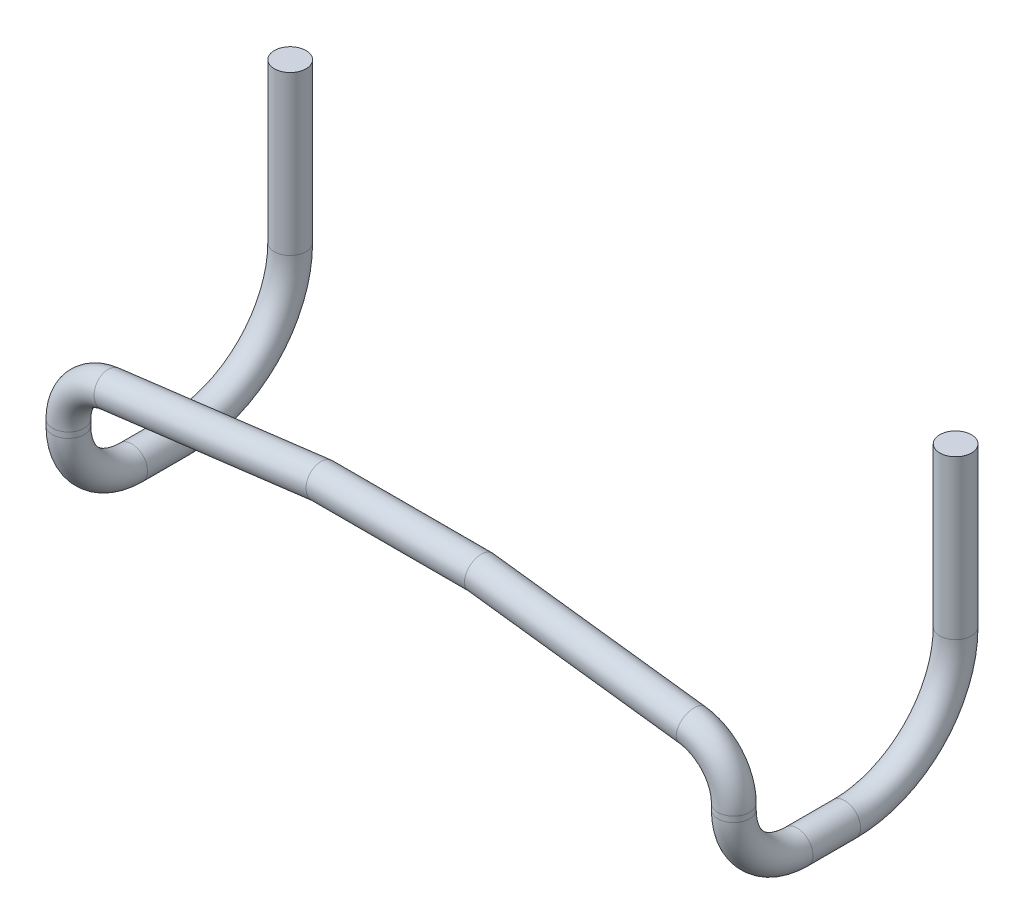
ISO-10303-21;
HEADER;
FILE_DESCRIPTION(('STEP AP214'),'2;1');
FILE_NAME('part.step','',(''),(''),'','','');
FILE_SCHEMA(('AUTOMOTIVE_DESIGN { 1 0 10303 214 1 1 1 1 }'));
ENDSEC;
DATA;
#1=APPLICATION_CONTEXT('core data for automotive mechanical design processes');
#2=APPLICATION_PROTOCOL_DEFINITION('international standard','automotive_design',2000,#1);
#3=PRODUCT_CONTEXT('',#1,'mechanical');
#4=PRODUCT('Part','Part','',(#3));
#5=PRODUCT_RELATED_PRODUCT_CATEGORY('part','',(#4));
#6=PRODUCT_DEFINITION_FORMATION('','',#4);
#7=PRODUCT_DEFINITION_CONTEXT('part definition',#1,'design');
#8=PRODUCT_DEFINITION('design','',#6,#7);
#9=PRODUCT_DEFINITION_SHAPE('','',#8);
#10=(LENGTH_UNIT() NAMED_UNIT(*) SI_UNIT(.MILLI.,.METRE.));
#11=(NAMED_UNIT(*) PLANE_ANGLE_UNIT() SI_UNIT($,.RADIAN.));
#12=(NAMED_UNIT(*) SI_UNIT($,.STERADIAN.) SOLID_ANGLE_UNIT());
#13=UNCERTAINTY_MEASURE_WITH_UNIT(LENGTH_MEASURE(1.E-05),#10,'distance_accuracy_value','');
#14=(GEOMETRIC_REPRESENTATION_CONTEXT(3) GLOBAL_UNCERTAINTY_ASSIGNED_CONTEXT((#13)) GLOBAL_UNIT_ASSIGNED_CONTEXT((#10,
#11,#12)) REPRESENTATION_CONTEXT('',''));
#15=CARTESIAN_POINT('',(0.,0.,0.));
#16=DIRECTION('',(0.,0.,1.));
#17=DIRECTION('',(1.,0.,0.));
#18=AXIS2_PLACEMENT_3D('',#15,#16,#17);
#19=CARTESIAN_POINT('',(210.,80.,-140.));
#20=DIRECTION('',(0.,-1.,0.));
#21=DIRECTION('',(0.,0.,-1.));
#22=AXIS2_PLACEMENT_3D('',#19,#20,#21);
#23=PLANE('',#22);
#24=CARTESIAN_POINT('',(210.,80.,-140.));
#25=DIRECTION('',(0.,-1.,0.));
#26=DIRECTION('',(0.,0.,-1.));
#27=AXIS2_PLACEMENT_3D('',#24,#25,#26);
#28=CIRCLE('',#27,10.);
#29=CARTESIAN_POINT('',(210.,80.,-150.));
#30=VERTEX_POINT('',#29);
#31=EDGE_CURVE('E79',#30,#30,#28,.T.);
#32=ORIENTED_EDGE('',*,*,#31,.F.);
#33=EDGE_LOOP('',(#32));
#34=FACE_BOUND('',#33,.T.);
#35=ADVANCED_FACE('F61',(#34),#23,.F.);
#36=CARTESIAN_POINT('',(48.5416785139341,0.182290185758244,0.));
#37=DIRECTION('',(0.992277876713668,-0.124034734589209,0.));
#38=DIRECTION('',(0.124034734589209,0.992277876713668,0.));
#39=AXIS2_PLACEMENT_3D('',#36,#37,#38);
#40=CYLINDRICAL_SURFACE('',#39,10.);
#41=CARTESIAN_POINT('',(50.,0.,0.));
#42=DIRECTION('',(0.99806760209759,-0.0621374415563289,0.));
#43=DIRECTION('',(0.0621374415563289,0.99806760209759,0.));
#44=AXIS2_PLACEMENT_3D('',#41,#42,#43);
#45=ELLIPSE('',#44,10.0193613929392,10.);
#46=CARTESIAN_POINT('',(50.6225774829855,10.,0.));
#47=VERTEX_POINT('',#46);
#48=EDGE_CURVE('E11',#47,#47,#45,.T.);
#49=ORIENTED_EDGE('',*,*,#48,.T.);
#50=EDGE_LOOP('',(#49));
#51=FACE_BOUND('',#50,.T.);
#52=CARTESIAN_POINT('',(183.721042037676,-16.7151302547096,0.));
#53=DIRECTION('',(-0.992277876713668,0.124034734589209,0.));
#54=DIRECTION('',(0.,0.,1.));
#55=AXIS2_PLACEMENT_3D('',#52,#53,#54);
#56=CIRCLE('',#55,10.);
#57=CARTESIAN_POINT('',(184.961389383568,-6.79235148757287,0.));
#58=VERTEX_POINT('',#57);
#59=EDGE_CURVE('E64',#58,#58,#56,.T.);
#60=ORIENTED_EDGE('',*,*,#59,.T.);
#61=EDGE_LOOP('',(#60));
#62=FACE_BOUND('',#61,.T.);
#63=ADVANCED_FACE('F118',(#51,#62),#40,.T.);
#64=CARTESIAN_POINT('',(180.,-46.4834665561196,0.));
#65=DIRECTION('',(0.,0.,-1.));
#66=DIRECTION('',(-1.,0.,0.));
#67=AXIS2_PLACEMENT_3D('',#64,#65,#66);
#68=TOROIDAL_SURFACE('',#67,30.,10.);
#69=CARTESIAN_POINT('',(210.,-46.4834665561196,0.));
#70=DIRECTION('',(0.,1.,0.));
#71=DIRECTION('',(0.,0.,1.));
#72=AXIS2_PLACEMENT_3D('',#69,#70,#71);
#73=CIRCLE('',#72,10.);
#74=CARTESIAN_POINT('',(220.,-46.4834665561196,0.));
#75=VERTEX_POINT('',#74);
#76=EDGE_CURVE('E74',#75,#75,#73,.T.);
#77=CARTESIAN_POINT('',(180.,-46.4834665561196,0.));
#78=DIRECTION('',(0.,0.,-1.));
#79=DIRECTION('',(-1.,0.,0.));
#80=AXIS2_PLACEMENT_3D('',#77,#78,#79);
#81=CIRCLE('',#80,40.);
#82=EDGE_CURVE('',#58,#75,#81,.T.);
#83=ORIENTED_EDGE('',*,*,#59,.F.);
#84=ORIENTED_EDGE('',*,*,#76,.T.);
#85=ORIENTED_EDGE('',*,*,#82,.T.);
#86=ORIENTED_EDGE('',*,*,#82,.F.);
#87=EDGE_LOOP('',(#83,#85,#84,#86));
#88=FACE_BOUND('',#87,.T.);
#89=ADVANCED_FACE('F103',(#88),#68,.T.);
#90=CARTESIAN_POINT('',(210.,-46.4834665561196,0.));
#91=DIRECTION('',(0.,-1.,0.));
#92=DIRECTION('',(0.,0.,-1.));
#93=AXIS2_PLACEMENT_3D('',#90,#91,#92);
#94=CYLINDRICAL_SURFACE('',#93,10.);
#95=CARTESIAN_POINT('',(210.,-50.,0.));
#96=DIRECTION('',(0.,1.,0.));
#97=DIRECTION('',(0.,0.,1.));
#98=AXIS2_PLACEMENT_3D('',#95,#96,#97);
#99=CIRCLE('',#98,10.);
#100=CARTESIAN_POINT('',(210.,-50.,10.));
#101=VERTEX_POINT('',#100);
#102=EDGE_CURVE('E96',#101,#101,#99,.T.);
#103=ORIENTED_EDGE('',*,*,#102,.T.);
#104=EDGE_LOOP('',(#103));
#105=FACE_BOUND('',#104,.T.);
#106=ORIENTED_EDGE('',*,*,#76,.F.);
#107=EDGE_LOOP('',(#106));
#108=FACE_BOUND('',#107,.T.);
#109=ADVANCED_FACE('F106',(#105,#108),#94,.T.);
#110=CARTESIAN_POINT('',(210.,-50.,-40.));
#111=DIRECTION('',(1.,0.,0.));
#112=DIRECTION('',(0.,0.,-1.));
#113=AXIS2_PLACEMENT_3D('',#110,#111,#112);
#114=TOROIDAL_SURFACE('',#113,40.,10.);
#115=CARTESIAN_POINT('',(210.,-90.,-40.));
#116=DIRECTION('',(0.,0.,1.));
#117=DIRECTION('',(0.,-1.,0.));
#118=AXIS2_PLACEMENT_3D('',#115,#116,#117);
#119=CIRCLE('',#118,10.);
#120=CARTESIAN_POINT('',(210.,-100.,-40.));
#121=VERTEX_POINT('',#120);
#122=EDGE_CURVE('E92',#121,#121,#119,.T.);
#123=CARTESIAN_POINT('',(210.,-50.,-40.));
#124=DIRECTION('',(1.,0.,0.));
#125=DIRECTION('',(0.,0.,-1.));
#126=AXIS2_PLACEMENT_3D('',#123,#124,#125);
#127=CIRCLE('',#126,50.);
#128=EDGE_CURVE('',#101,#121,#127,.T.);
#129=ORIENTED_EDGE('',*,*,#102,.F.);
#130=ORIENTED_EDGE('',*,*,#122,.T.);
#131=ORIENTED_EDGE('',*,*,#128,.T.);
#132=ORIENTED_EDGE('',*,*,#128,.F.);
#133=EDGE_LOOP('',(#129,#131,#130,#132));
#134=FACE_BOUND('',#133,.T.);
#135=ADVANCED_FACE('F108',(#134),#114,.T.);
#136=CARTESIAN_POINT('',(210.,-90.,-40.));
#137=DIRECTION('',(0.,0.,-1.));
#138=DIRECTION('',(-1.,0.,0.));
#139=AXIS2_PLACEMENT_3D('',#136,#137,#138);
#140=CYLINDRICAL_SURFACE('',#139,10.);
#141=CARTESIAN_POINT('',(210.,-90.,-70.));
#142=DIRECTION('',(0.,0.,1.));
#143=DIRECTION('',(0.,-1.,0.));
#144=AXIS2_PLACEMENT_3D('',#141,#142,#143);
#145=CIRCLE('',#144,10.);
#146=CARTESIAN_POINT('',(210.,-100.,-70.));
#147=VERTEX_POINT('',#146);
#148=EDGE_CURVE('E88',#147,#147,#145,.T.);
#149=ORIENTED_EDGE('',*,*,#148,.T.);
#150=EDGE_LOOP('',(#149));
#151=FACE_BOUND('',#150,.T.);
#152=ORIENTED_EDGE('',*,*,#122,.F.);
#153=EDGE_LOOP('',(#152));
#154=FACE_BOUND('',#153,.T.);
#155=ADVANCED_FACE('F115',(#151,#154),#140,.T.);
#156=CARTESIAN_POINT('',(210.,-20.,-70.));
#157=DIRECTION('',(1.,0.,0.));
#158=DIRECTION('',(0.,0.,-1.));
#159=AXIS2_PLACEMENT_3D('',#156,#157,#158);
#160=TOROIDAL_SURFACE('',#159,70.,10.);
#161=CARTESIAN_POINT('',(210.,-20.,-140.));
#162=DIRECTION('',(0.,-1.,0.));
#163=DIRECTION('',(0.,0.,-1.));
#164=AXIS2_PLACEMENT_3D('',#161,#162,#163);
#165=CIRCLE('',#164,10.);
#166=CARTESIAN_POINT('',(210.,-20.,-150.));
#167=VERTEX_POINT('',#166);
#168=EDGE_CURVE('E83',#167,#167,#165,.T.);
#169=CARTESIAN_POINT('',(210.,-20.,-70.));
#170=DIRECTION('',(1.,0.,0.));
#171=DIRECTION('',(0.,0.,-1.));
#172=AXIS2_PLACEMENT_3D('',#169,#170,#171);
#173=CIRCLE('',#172,80.);
#174=EDGE_CURVE('',#147,#167,#173,.T.);
#175=ORIENTED_EDGE('',*,*,#148,.F.);
#176=ORIENTED_EDGE('',*,*,#168,.T.);
#177=ORIENTED_EDGE('',*,*,#174,.T.);
#178=ORIENTED_EDGE('',*,*,#174,.F.);
#179=EDGE_LOOP('',(#175,#177,#176,#178));
#180=FACE_BOUND('',#179,.T.);
#181=ADVANCED_FACE('F133',(#180),#160,.T.);
#182=CARTESIAN_POINT('',(210.,-20.,-140.));
#183=DIRECTION('',(0.,1.,0.));
#184=DIRECTION('',(0.,0.,1.));
#185=AXIS2_PLACEMENT_3D('',#182,#183,#184);
#186=CYLINDRICAL_SURFACE('',#185,10.);
#187=ORIENTED_EDGE('',*,*,#31,.T.);
#188=EDGE_LOOP('',(#187));
#189=FACE_BOUND('',#188,.T.);
#190=ORIENTED_EDGE('',*,*,#168,.F.);
#191=EDGE_LOOP('',(#190));
#192=FACE_BOUND('',#191,.T.);
#193=ADVANCED_FACE('F123',(#189,#192),#186,.T.);
#194=CARTESIAN_POINT('',(0.,0.,0.));
#195=DIRECTION('',(1.,0.,0.));
#196=DIRECTION('',(0.,0.,-1.));
#197=AXIS2_PLACEMENT_3D('',#194,#195,#196);
#198=CYLINDRICAL_SURFACE('',#197,10.);
#199=ORIENTED_EDGE('',*,*,#48,.F.);
#200=EDGE_LOOP('',(#199));
#201=FACE_BOUND('',#200,.T.);
#202=CARTESIAN_POINT('',(-50.,0.,0.));
#203=DIRECTION('',(-0.99806760209759,-0.0621374415563289,0.));
#204=DIRECTION('',(-0.0621374415563289,0.99806760209759,0.));
#205=AXIS2_PLACEMENT_3D('',#202,#203,#204);
#206=ELLIPSE('',#205,10.0193613929392,10.);
#207=CARTESIAN_POINT('',(-50.6225774829855,10.,0.));
#208=VERTEX_POINT('',#207);
#209=EDGE_CURVE('E84',#208,#208,#206,.T.);
#210=ORIENTED_EDGE('',*,*,#209,.F.);
#211=EDGE_LOOP('',(#210));
#212=FACE_BOUND('',#211,.T.);
#213=ADVANCED_FACE('F120',(#201,#212),#198,.T.);
#214=CARTESIAN_POINT('',(-210.,80.,-140.));
#215=DIRECTION('',(0.,-1.,0.));
#216=DIRECTION('',(0.,0.,-1.));
#217=AXIS2_PLACEMENT_3D('',#214,#215,#216);
#218=PLANE('',#217);
#219=CARTESIAN_POINT('',(-210.,80.,-140.));
#220=DIRECTION('',(0.,1.,0.));
#221=DIRECTION('',(0.,0.,-1.));
#222=AXIS2_PLACEMENT_3D('',#219,#220,#221);
#223=CIRCLE('',#222,10.);
#224=CARTESIAN_POINT('',(-210.,80.,-150.));
#225=VERTEX_POINT('',#224);
#226=EDGE_CURVE('E286',#225,#225,#223,.F.);
#227=ORIENTED_EDGE('',*,*,#226,.F.);
#228=EDGE_LOOP('',(#227));
#229=FACE_BOUND('',#228,.T.);
#230=ADVANCED_FACE('F122',(#229),#218,.F.);
#231=CARTESIAN_POINT('',(-48.5416785139341,0.182290185758244,0.));
#232=DIRECTION('',(-0.992277876713668,-0.124034734589209,0.));
#233=DIRECTION('',(0.124034734589209,-0.992277876713668,0.));
#234=AXIS2_PLACEMENT_3D('',#231,#232,#233);
#235=CYLINDRICAL_SURFACE('',#234,10.);
#236=ORIENTED_EDGE('',*,*,#209,.T.);
#237=EDGE_LOOP('',(#236));
#238=FACE_BOUND('',#237,.T.);
#239=CARTESIAN_POINT('',(-183.721042037676,-16.7151302547096,0.));
#240=DIRECTION('',(-0.992277876713668,-0.124034734589209,0.));
#241=DIRECTION('',(0.,0.,1.));
#242=AXIS2_PLACEMENT_3D('',#239,#240,#241);
#243=CIRCLE('',#242,10.);
#244=CARTESIAN_POINT('',(-184.961389383568,-6.79235148757287,0.));
#245=VERTEX_POINT('',#244);
#246=EDGE_CURVE('E77',#245,#245,#243,.F.);
#247=ORIENTED_EDGE('',*,*,#246,.T.);
#248=EDGE_LOOP('',(#247));
#249=FACE_BOUND('',#248,.T.);
#250=ADVANCED_FACE('F130',(#238,#249),#235,.T.);
#251=CARTESIAN_POINT('',(-180.,-46.4834665561196,0.));
#252=DIRECTION('',(0.,0.,1.));
#253=DIRECTION('',(1.,0.,0.));
#254=AXIS2_PLACEMENT_3D('',#251,#252,#253);
#255=TOROIDAL_SURFACE('',#254,30.,10.);
#256=CARTESIAN_POINT('',(-210.,-46.4834665561196,0.));
#257=DIRECTION('',(0.,-1.,0.));
#258=DIRECTION('',(0.,0.,1.));
#259=AXIS2_PLACEMENT_3D('',#256,#257,#258);
#260=CIRCLE('',#259,10.);
#261=CARTESIAN_POINT('',(-220.,-46.4834665561196,0.));
#262=VERTEX_POINT('',#261);
#263=EDGE_CURVE('E307',#262,#262,#260,.F.);
#264=CARTESIAN_POINT('',(-180.,-46.4834665561196,0.));
#265=DIRECTION('',(0.,0.,1.));
#266=DIRECTION('',(1.,0.,0.));
#267=AXIS2_PLACEMENT_3D('',#264,#265,#266);
#268=CIRCLE('',#267,40.);
#269=EDGE_CURVE('',#245,#262,#268,.T.);
#270=ORIENTED_EDGE('',*,*,#246,.F.);
#271=ORIENTED_EDGE('',*,*,#263,.T.);
#272=ORIENTED_EDGE('',*,*,#269,.T.);
#273=ORIENTED_EDGE('',*,*,#269,.F.);
#274=EDGE_LOOP('',(#270,#272,#271,#273));
#275=FACE_BOUND('',#274,.T.);
#276=ADVANCED_FACE('F182',(#275),#255,.T.);
#277=CARTESIAN_POINT('',(-210.,-46.4834665561196,0.));
#278=DIRECTION('',(0.,-1.,0.));
#279=DIRECTION('',(0.,0.,-1.));
#280=AXIS2_PLACEMENT_3D('',#277,#278,#279);
#281=CYLINDRICAL_SURFACE('',#280,10.);
#282=CARTESIAN_POINT('',(-210.,-50.,0.));
#283=DIRECTION('',(0.,-1.,0.));
#284=DIRECTION('',(0.,0.,1.));
#285=AXIS2_PLACEMENT_3D('',#282,#283,#284);
#286=CIRCLE('',#285,10.);
#287=CARTESIAN_POINT('',(-210.,-50.,10.));
#288=VERTEX_POINT('',#287);
#289=EDGE_CURVE('E304',#288,#288,#286,.F.);
#290=ORIENTED_EDGE('',*,*,#289,.T.);
#291=EDGE_LOOP('',(#290));
#292=FACE_BOUND('',#291,.T.);
#293=ORIENTED_EDGE('',*,*,#263,.F.);
#294=EDGE_LOOP('',(#293));
#295=FACE_BOUND('',#294,.T.);
#296=ADVANCED_FACE('F191',(#292,#295),#281,.T.);
#297=CARTESIAN_POINT('',(-210.,-50.,-40.));
#298=DIRECTION('',(1.,0.,0.));
#299=DIRECTION('',(0.,0.,-1.));
#300=AXIS2_PLACEMENT_3D('',#297,#298,#299);
#301=TOROIDAL_SURFACE('',#300,40.,10.);
#302=CARTESIAN_POINT('',(-210.,-90.,-40.));
#303=DIRECTION('',(0.,0.,-1.));
#304=DIRECTION('',(0.,-1.,0.));
#305=AXIS2_PLACEMENT_3D('',#302,#303,#304);
#306=CIRCLE('',#305,10.);
#307=CARTESIAN_POINT('',(-210.,-100.,-40.));
#308=VERTEX_POINT('',#307);
#309=EDGE_CURVE('E296',#308,#308,#306,.F.);
#310=CARTESIAN_POINT('',(-210.,-50.,-40.));
#311=DIRECTION('',(1.,0.,0.));
#312=DIRECTION('',(0.,0.,-1.));
#313=AXIS2_PLACEMENT_3D('',#310,#311,#312);
#314=CIRCLE('',#313,50.);
#315=EDGE_CURVE('',#288,#308,#314,.T.);
#316=ORIENTED_EDGE('',*,*,#289,.F.);
#317=ORIENTED_EDGE('',*,*,#309,.T.);
#318=ORIENTED_EDGE('',*,*,#315,.T.);
#319=ORIENTED_EDGE('',*,*,#315,.F.);
#320=EDGE_LOOP('',(#316,#318,#317,#319));
#321=FACE_BOUND('',#320,.T.);
#322=ADVANCED_FACE('F201',(#321),#301,.T.);
#323=CARTESIAN_POINT('',(-210.,-90.,-40.));
#324=DIRECTION('',(0.,0.,-1.));
#325=DIRECTION('',(-1.,0.,0.));
#326=AXIS2_PLACEMENT_3D('',#323,#324,#325);
#327=CYLINDRICAL_SURFACE('',#326,10.);
#328=CARTESIAN_POINT('',(-210.,-90.,-70.));
#329=DIRECTION('',(0.,0.,-1.));
#330=DIRECTION('',(0.,-1.,0.));
#331=AXIS2_PLACEMENT_3D('',#328,#329,#330);
#332=CIRCLE('',#331,10.);
#333=CARTESIAN_POINT('',(-210.,-100.,-70.));
#334=VERTEX_POINT('',#333);
#335=EDGE_CURVE('E291',#334,#334,#332,.F.);
#336=ORIENTED_EDGE('',*,*,#335,.T.);
#337=EDGE_LOOP('',(#336));
#338=FACE_BOUND('',#337,.T.);
#339=ORIENTED_EDGE('',*,*,#309,.F.);
#340=EDGE_LOOP('',(#339));
#341=FACE_BOUND('',#340,.T.);
#342=ADVANCED_FACE('F211',(#338,#341),#327,.T.);
#343=CARTESIAN_POINT('',(-210.,-20.,-70.));
#344=DIRECTION('',(1.,0.,0.));
#345=DIRECTION('',(0.,0.,-1.));
#346=AXIS2_PLACEMENT_3D('',#343,#344,#345);
#347=TOROIDAL_SURFACE('',#346,70.,10.);
#348=CARTESIAN_POINT('',(-210.,-20.,-140.));
#349=DIRECTION('',(0.,1.,0.));
#350=DIRECTION('',(0.,0.,-1.));
#351=AXIS2_PLACEMENT_3D('',#348,#349,#350);
#352=CIRCLE('',#351,10.);
#353=CARTESIAN_POINT('',(-210.,-20.,-150.));
#354=VERTEX_POINT('',#353);
#355=EDGE_CURVE('E289',#354,#354,#352,.F.);
#356=CARTESIAN_POINT('',(-210.,-20.,-70.));
#357=DIRECTION('',(1.,0.,0.));
#358=DIRECTION('',(0.,0.,-1.));
#359=AXIS2_PLACEMENT_3D('',#356,#357,#358);
#360=CIRCLE('',#359,80.);
#361=EDGE_CURVE('',#334,#354,#360,.T.);
#362=ORIENTED_EDGE('',*,*,#335,.F.);
#363=ORIENTED_EDGE('',*,*,#355,.T.);
#364=ORIENTED_EDGE('',*,*,#361,.T.);
#365=ORIENTED_EDGE('',*,*,#361,.F.);
#366=EDGE_LOOP('',(#362,#364,#363,#365));
#367=FACE_BOUND('',#366,.T.);
#368=ADVANCED_FACE('F221',(#367),#347,.T.);
#369=CARTESIAN_POINT('',(-210.,-20.,-140.));
#370=DIRECTION('',(0.,1.,0.));
#371=DIRECTION('',(0.,0.,1.));
#372=AXIS2_PLACEMENT_3D('',#369,#370,#371);
#373=CYLINDRICAL_SURFACE('',#372,10.);
#374=ORIENTED_EDGE('',*,*,#226,.T.);
#375=EDGE_LOOP('',(#374));
#376=FACE_BOUND('',#375,.T.);
#377=ORIENTED_EDGE('',*,*,#355,.F.);
#378=EDGE_LOOP('',(#377));
#379=FACE_BOUND('',#378,.T.);
#380=ADVANCED_FACE('F231',(#376,#379),#373,.T.);
#381=CLOSED_SHELL('',(#35,#63,#89,#109,#135,#155,#181,#193,#213,#230,#250,#276,#296,#322,#342,
#368,#380));
#382=MANIFOLD_SOLID_BREP('B2',#381);
#383=ADVANCED_BREP_SHAPE_REPRESENTATION('',(#18,#382),#14);
#384=SHAPE_DEFINITION_REPRESENTATION(#9,#383);
ENDSEC;
END-ISO-10303-21;
